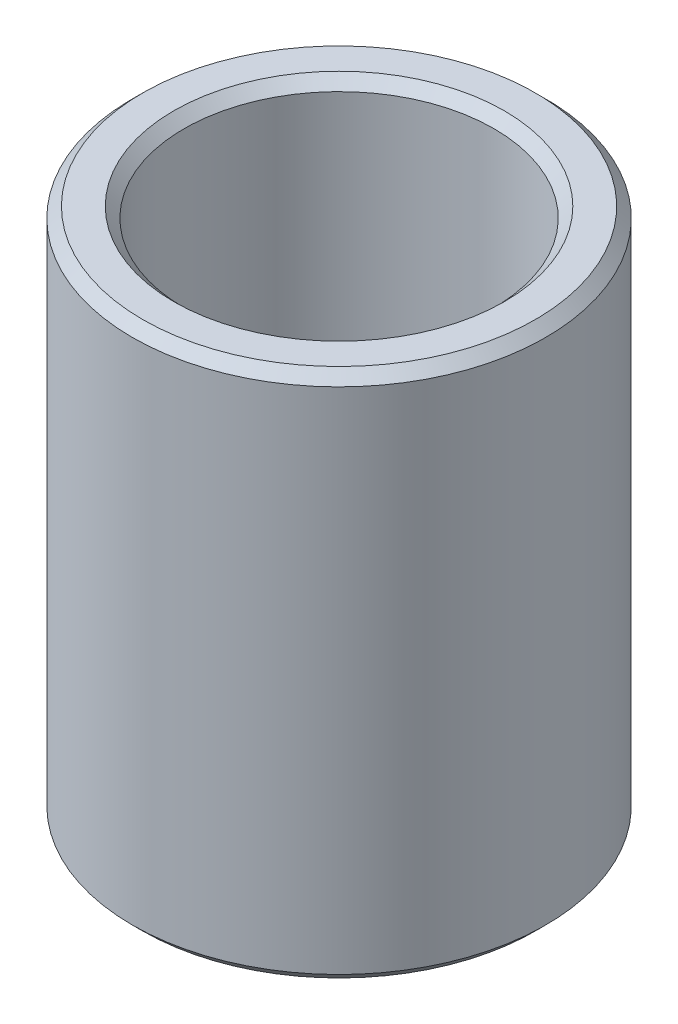
ISO-10303-21;
HEADER;
FILE_DESCRIPTION(('STEP AP214'),'2;1');
FILE_NAME('part.step','',(''),(''),'','','');
FILE_SCHEMA(('AUTOMOTIVE_DESIGN { 1 0 10303 214 1 1 1 1 }'));
ENDSEC;
DATA;
#1=APPLICATION_CONTEXT('core data for automotive mechanical design processes');
#2=APPLICATION_PROTOCOL_DEFINITION('international standard','automotive_design',2000,#1);
#3=PRODUCT_CONTEXT('',#1,'mechanical');
#4=PRODUCT('Part','Part','',(#3));
#5=PRODUCT_RELATED_PRODUCT_CATEGORY('part','',(#4));
#6=PRODUCT_DEFINITION_FORMATION('','',#4);
#7=PRODUCT_DEFINITION_CONTEXT('part definition',#1,'design');
#8=PRODUCT_DEFINITION('design','',#6,#7);
#9=PRODUCT_DEFINITION_SHAPE('','',#8);
#10=(LENGTH_UNIT() NAMED_UNIT(*) SI_UNIT(.MILLI.,.METRE.));
#11=(NAMED_UNIT(*) PLANE_ANGLE_UNIT() SI_UNIT($,.RADIAN.));
#12=(NAMED_UNIT(*) SI_UNIT($,.STERADIAN.) SOLID_ANGLE_UNIT());
#13=UNCERTAINTY_MEASURE_WITH_UNIT(LENGTH_MEASURE(1.E-05),#10,'distance_accuracy_value','');
#14=(GEOMETRIC_REPRESENTATION_CONTEXT(3) GLOBAL_UNCERTAINTY_ASSIGNED_CONTEXT((#13)) GLOBAL_UNIT_ASSIGNED_CONTEXT((#10,
#11,#12)) REPRESENTATION_CONTEXT('',''));
#15=CARTESIAN_POINT('',(0.,0.,0.));
#16=DIRECTION('',(0.,0.,1.));
#17=DIRECTION('',(1.,0.,0.));
#18=AXIS2_PLACEMENT_3D('',#15,#16,#17);
#19=CARTESIAN_POINT('',(0.,10.25,0.));
#20=DIRECTION('',(0.,1.,0.));
#21=DIRECTION('',(0.,0.,1.));
#22=AXIS2_PLACEMENT_3D('',#19,#20,#21);
#23=PLANE('',#22);
#24=CARTESIAN_POINT('',(0.,10.25,0.));
#25=DIRECTION('',(0.,1.,0.));
#26=DIRECTION('',(0.,0.,1.));
#27=AXIS2_PLACEMENT_3D('',#24,#25,#26);
#28=CIRCLE('',#27,3.8);
#29=CARTESIAN_POINT('',(0.,10.25,3.8));
#30=VERTEX_POINT('',#29);
#31=EDGE_CURVE('E43',#30,#30,#28,.T.);
#32=ORIENTED_EDGE('',*,*,#31,.T.);
#33=EDGE_LOOP('',(#32));
#34=FACE_BOUND('',#33,.T.);
#35=CARTESIAN_POINT('',(0.,10.25,0.));
#36=DIRECTION('',(0.,1.,0.));
#37=DIRECTION('',(0.,0.,1.));
#38=AXIS2_PLACEMENT_3D('',#35,#36,#37);
#39=CIRCLE('',#38,3.2);
#40=CARTESIAN_POINT('',(0.,10.25,3.2));
#41=VERTEX_POINT('',#40);
#42=EDGE_CURVE('E47',#41,#41,#39,.F.);
#43=ORIENTED_EDGE('',*,*,#42,.T.);
#44=EDGE_LOOP('',(#43));
#45=FACE_BOUND('',#44,.T.);
#46=ADVANCED_FACE('F32',(#34,#45),#23,.T.);
#47=CARTESIAN_POINT('',(0.,0.,0.));
#48=DIRECTION('',(0.,1.,0.));
#49=DIRECTION('',(0.,0.,1.));
#50=AXIS2_PLACEMENT_3D('',#47,#48,#49);
#51=PLANE('',#50);
#52=CARTESIAN_POINT('',(0.,0.,0.));
#53=DIRECTION('',(0.,1.,0.));
#54=DIRECTION('',(0.,0.,1.));
#55=AXIS2_PLACEMENT_3D('',#52,#53,#54);
#56=CIRCLE('',#55,3.8);
#57=CARTESIAN_POINT('',(0.,0.,3.8));
#58=VERTEX_POINT('',#57);
#59=EDGE_CURVE('E52',#58,#58,#56,.F.);
#60=ORIENTED_EDGE('',*,*,#59,.T.);
#61=EDGE_LOOP('',(#60));
#62=FACE_BOUND('',#61,.T.);
#63=CARTESIAN_POINT('',(0.,0.,0.));
#64=DIRECTION('',(0.,1.,0.));
#65=DIRECTION('',(0.,0.,1.));
#66=AXIS2_PLACEMENT_3D('',#63,#64,#65);
#67=CIRCLE('',#66,3.2);
#68=CARTESIAN_POINT('',(0.,0.,3.2));
#69=VERTEX_POINT('',#68);
#70=EDGE_CURVE('E55',#69,#69,#67,.T.);
#71=ORIENTED_EDGE('',*,*,#70,.T.);
#72=EDGE_LOOP('',(#71));
#73=FACE_BOUND('',#72,.T.);
#74=ADVANCED_FACE('F77',(#62,#73),#51,.F.);
#75=CARTESIAN_POINT('',(0.,10.25,0.));
#76=DIRECTION('',(0.,-1.,0.));
#77=DIRECTION('',(0.,0.,-1.));
#78=AXIS2_PLACEMENT_3D('',#75,#76,#77);
#79=CYLINDRICAL_SURFACE('',#78,4.);
#80=CARTESIAN_POINT('',(0.,0.200000000000001,0.));
#81=DIRECTION('',(0.,1.,0.));
#82=DIRECTION('',(0.,0.,1.));
#83=AXIS2_PLACEMENT_3D('',#80,#81,#82);
#84=CIRCLE('',#83,4.);
#85=CARTESIAN_POINT('',(0.,0.200000000000001,4.));
#86=VERTEX_POINT('',#85);
#87=EDGE_CURVE('E58',#86,#86,#84,.T.);
#88=ORIENTED_EDGE('',*,*,#87,.T.);
#89=EDGE_LOOP('',(#88));
#90=FACE_BOUND('',#89,.T.);
#91=CARTESIAN_POINT('',(0.,10.05,0.));
#92=DIRECTION('',(0.,1.,0.));
#93=DIRECTION('',(0.,0.,1.));
#94=AXIS2_PLACEMENT_3D('',#91,#92,#93);
#95=CIRCLE('',#94,4.);
#96=CARTESIAN_POINT('',(0.,10.05,4.));
#97=VERTEX_POINT('',#96);
#98=EDGE_CURVE('E61',#97,#97,#95,.F.);
#99=ORIENTED_EDGE('',*,*,#98,.T.);
#100=EDGE_LOOP('',(#99));
#101=FACE_BOUND('',#100,.T.);
#102=ADVANCED_FACE('F65',(#90,#101),#79,.T.);
#103=CARTESIAN_POINT('',(0.,10.25,0.));
#104=DIRECTION('',(0.,-1.,0.));
#105=DIRECTION('',(0.,0.,-1.));
#106=AXIS2_PLACEMENT_3D('',#103,#104,#105);
#107=CYLINDRICAL_SURFACE('',#106,3.);
#108=CARTESIAN_POINT('',(0.,0.200000000000001,0.));
#109=DIRECTION('',(0.,1.,0.));
#110=DIRECTION('',(0.,0.,1.));
#111=AXIS2_PLACEMENT_3D('',#108,#109,#110);
#112=CIRCLE('',#111,3.);
#113=CARTESIAN_POINT('',(0.,0.200000000000001,3.));
#114=VERTEX_POINT('',#113);
#115=EDGE_CURVE('E10',#114,#114,#112,.F.);
#116=ORIENTED_EDGE('',*,*,#115,.T.);
#117=EDGE_LOOP('',(#116));
#118=FACE_BOUND('',#117,.T.);
#119=CARTESIAN_POINT('',(0.,10.05,0.));
#120=DIRECTION('',(0.,1.,0.));
#121=DIRECTION('',(0.,0.,1.));
#122=AXIS2_PLACEMENT_3D('',#119,#120,#121);
#123=CIRCLE('',#122,3.);
#124=CARTESIAN_POINT('',(0.,10.05,3.));
#125=VERTEX_POINT('',#124);
#126=EDGE_CURVE('E39',#125,#125,#123,.T.);
#127=ORIENTED_EDGE('',*,*,#126,.T.);
#128=EDGE_LOOP('',(#127));
#129=FACE_BOUND('',#128,.T.);
#130=ADVANCED_FACE('F93',(#118,#129),#107,.F.);
#131=CARTESIAN_POINT('',(0.,0.200000000000001,0.));
#132=DIRECTION('',(0.,1.,0.));
#133=DIRECTION('',(0.,0.,1.));
#134=AXIS2_PLACEMENT_3D('',#131,#132,#133);
#135=CONICAL_SURFACE('',#134,4.,0.785398163397453);
#136=ORIENTED_EDGE('',*,*,#59,.F.);
#137=EDGE_LOOP('',(#136));
#138=FACE_BOUND('',#137,.T.);
#139=ORIENTED_EDGE('',*,*,#87,.F.);
#140=EDGE_LOOP('',(#139));
#141=FACE_BOUND('',#140,.T.);
#142=ADVANCED_FACE('F71',(#138,#141),#135,.T.);
#143=CARTESIAN_POINT('',(0.,10.25,0.));
#144=DIRECTION('',(0.,-1.,0.));
#145=DIRECTION('',(0.,0.,-1.));
#146=AXIS2_PLACEMENT_3D('',#143,#144,#145);
#147=CONICAL_SURFACE('',#146,3.8,0.785398163397448);
#148=ORIENTED_EDGE('',*,*,#98,.F.);
#149=EDGE_LOOP('',(#148));
#150=FACE_BOUND('',#149,.T.);
#151=ORIENTED_EDGE('',*,*,#31,.F.);
#152=EDGE_LOOP('',(#151));
#153=FACE_BOUND('',#152,.T.);
#154=ADVANCED_FACE('F67',(#150,#153),#147,.T.);
#155=CARTESIAN_POINT('',(0.,0.,0.));
#156=DIRECTION('',(0.,-1.,0.));
#157=DIRECTION('',(0.,0.,-1.));
#158=AXIS2_PLACEMENT_3D('',#155,#156,#157);
#159=CONICAL_SURFACE('',#158,3.2,0.785398163397444);
#160=ORIENTED_EDGE('',*,*,#115,.F.);
#161=EDGE_LOOP('',(#160));
#162=FACE_BOUND('',#161,.T.);
#163=ORIENTED_EDGE('',*,*,#70,.F.);
#164=EDGE_LOOP('',(#163));
#165=FACE_BOUND('',#164,.T.);
#166=ADVANCED_FACE('F70',(#162,#165),#159,.F.);
#167=CARTESIAN_POINT('',(0.,10.05,0.));
#168=DIRECTION('',(0.,1.,0.));
#169=DIRECTION('',(0.,0.,1.));
#170=AXIS2_PLACEMENT_3D('',#167,#168,#169);
#171=CONICAL_SURFACE('',#170,3.,0.785398163397449);
#172=ORIENTED_EDGE('',*,*,#42,.F.);
#173=EDGE_LOOP('',(#172));
#174=FACE_BOUND('',#173,.T.);
#175=ORIENTED_EDGE('',*,*,#126,.F.);
#176=EDGE_LOOP('',(#175));
#177=FACE_BOUND('',#176,.T.);
#178=ADVANCED_FACE('F34',(#174,#177),#171,.F.);
#179=CLOSED_SHELL('',(#46,#74,#102,#130,#142,#154,#166,#178));
#180=MANIFOLD_SOLID_BREP('B2',#179);
#181=ADVANCED_BREP_SHAPE_REPRESENTATION('',(#18,#180),#14);
#182=SHAPE_DEFINITION_REPRESENTATION(#9,#181);
ENDSEC;
END-ISO-10303-21;
